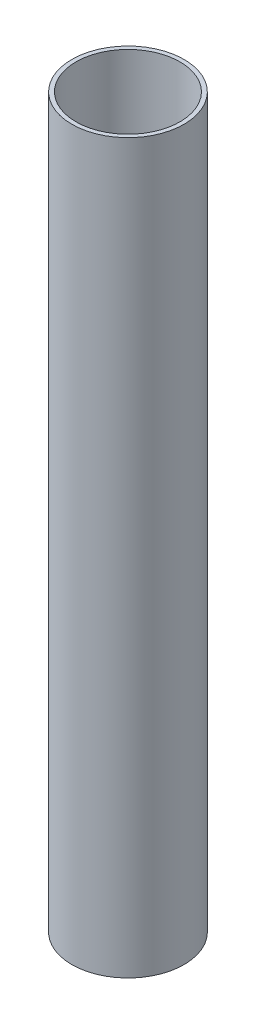
ISO-10303-21;
HEADER;
FILE_DESCRIPTION(('STEP AP214'),'2;1');
FILE_NAME('part.step','',(''),(''),'','','');
FILE_SCHEMA(('AUTOMOTIVE_DESIGN { 1 0 10303 214 1 1 1 1 }'));
ENDSEC;
DATA;
#1=APPLICATION_CONTEXT('core data for automotive mechanical design processes');
#2=APPLICATION_PROTOCOL_DEFINITION('international standard','automotive_design',2000,#1);
#3=PRODUCT_CONTEXT('',#1,'mechanical');
#4=PRODUCT('Part','Part','',(#3));
#5=PRODUCT_RELATED_PRODUCT_CATEGORY('part','',(#4));
#6=PRODUCT_DEFINITION_FORMATION('','',#4);
#7=PRODUCT_DEFINITION_CONTEXT('part definition',#1,'design');
#8=PRODUCT_DEFINITION('design','',#6,#7);
#9=PRODUCT_DEFINITION_SHAPE('','',#8);
#10=(LENGTH_UNIT() NAMED_UNIT(*) SI_UNIT(.MILLI.,.METRE.));
#11=(NAMED_UNIT(*) PLANE_ANGLE_UNIT() SI_UNIT($,.RADIAN.));
#12=(NAMED_UNIT(*) SI_UNIT($,.STERADIAN.) SOLID_ANGLE_UNIT());
#13=UNCERTAINTY_MEASURE_WITH_UNIT(LENGTH_MEASURE(1.E-05),#10,'distance_accuracy_value','');
#14=(GEOMETRIC_REPRESENTATION_CONTEXT(3) GLOBAL_UNCERTAINTY_ASSIGNED_CONTEXT((#13)) GLOBAL_UNIT_ASSIGNED_CONTEXT((#10,
#11,#12)) REPRESENTATION_CONTEXT('',''));
#15=CARTESIAN_POINT('',(0.,0.,0.));
#16=DIRECTION('',(0.,0.,1.));
#17=DIRECTION('',(1.,0.,0.));
#18=AXIS2_PLACEMENT_3D('',#15,#16,#17);
#19=CARTESIAN_POINT('',(0.,177.8,0.));
#20=DIRECTION('',(0.,1.,0.));
#21=DIRECTION('',(0.,0.,1.));
#22=AXIS2_PLACEMENT_3D('',#19,#20,#21);
#23=PLANE('',#22);
#24=CARTESIAN_POINT('',(0.,177.8,0.));
#25=DIRECTION('',(0.,1.,0.));
#26=DIRECTION('',(0.,0.,1.));
#27=AXIS2_PLACEMENT_3D('',#24,#25,#26);
#28=CIRCLE('',#27,13.716);
#29=CARTESIAN_POINT('',(0.,177.8,13.716));
#30=VERTEX_POINT('',#29);
#31=EDGE_CURVE('E10',#30,#30,#28,.T.);
#32=ORIENTED_EDGE('',*,*,#31,.T.);
#33=EDGE_LOOP('',(#32));
#34=FACE_BOUND('',#33,.T.);
#35=CARTESIAN_POINT('',(0.,177.8,0.));
#36=DIRECTION('',(0.,1.,0.));
#37=DIRECTION('',(0.,0.,1.));
#38=AXIS2_PLACEMENT_3D('',#35,#36,#37);
#39=CIRCLE('',#38,12.7);
#40=CARTESIAN_POINT('',(0.,177.8,12.7));
#41=VERTEX_POINT('',#40);
#42=EDGE_CURVE('E41',#41,#41,#39,.T.);
#43=ORIENTED_EDGE('',*,*,#42,.F.);
#44=EDGE_LOOP('',(#43));
#45=FACE_BOUND('',#44,.T.);
#46=ADVANCED_FACE('F30',(#34,#45),#23,.T.);
#47=CARTESIAN_POINT('',(0.,0.,0.));
#48=DIRECTION('',(0.,1.,0.));
#49=DIRECTION('',(0.,0.,1.));
#50=AXIS2_PLACEMENT_3D('',#47,#48,#49);
#51=PLANE('',#50);
#52=CARTESIAN_POINT('',(0.,0.,0.));
#53=DIRECTION('',(0.,1.,0.));
#54=DIRECTION('',(0.,0.,1.));
#55=AXIS2_PLACEMENT_3D('',#52,#53,#54);
#56=CIRCLE('',#55,13.716);
#57=CARTESIAN_POINT('',(0.,0.,13.716));
#58=VERTEX_POINT('',#57);
#59=EDGE_CURVE('E34',#58,#58,#56,.T.);
#60=ORIENTED_EDGE('',*,*,#59,.F.);
#61=EDGE_LOOP('',(#60));
#62=FACE_BOUND('',#61,.T.);
#63=CARTESIAN_POINT('',(0.,0.,0.));
#64=DIRECTION('',(0.,1.,0.));
#65=DIRECTION('',(0.,0.,1.));
#66=AXIS2_PLACEMENT_3D('',#63,#64,#65);
#67=CIRCLE('',#66,12.7);
#68=CARTESIAN_POINT('',(0.,0.,12.7));
#69=VERTEX_POINT('',#68);
#70=EDGE_CURVE('E43',#69,#69,#67,.T.);
#71=ORIENTED_EDGE('',*,*,#70,.T.);
#72=EDGE_LOOP('',(#71));
#73=FACE_BOUND('',#72,.T.);
#74=ADVANCED_FACE('F53',(#62,#73),#51,.F.);
#75=CARTESIAN_POINT('',(0.,177.8,0.));
#76=DIRECTION('',(0.,-1.,0.));
#77=DIRECTION('',(0.,0.,-1.));
#78=AXIS2_PLACEMENT_3D('',#75,#76,#77);
#79=CYLINDRICAL_SURFACE('',#78,13.716);
#80=ORIENTED_EDGE('',*,*,#31,.F.);
#81=EDGE_LOOP('',(#80));
#82=FACE_BOUND('',#81,.T.);
#83=ORIENTED_EDGE('',*,*,#59,.T.);
#84=EDGE_LOOP('',(#83));
#85=FACE_BOUND('',#84,.T.);
#86=ADVANCED_FACE('F32',(#82,#85),#79,.T.);
#87=CARTESIAN_POINT('',(0.,177.8,0.));
#88=DIRECTION('',(0.,-1.,0.));
#89=DIRECTION('',(0.,0.,-1.));
#90=AXIS2_PLACEMENT_3D('',#87,#88,#89);
#91=CYLINDRICAL_SURFACE('',#90,12.7);
#92=ORIENTED_EDGE('',*,*,#42,.T.);
#93=EDGE_LOOP('',(#92));
#94=FACE_BOUND('',#93,.T.);
#95=ORIENTED_EDGE('',*,*,#70,.F.);
#96=EDGE_LOOP('',(#95));
#97=FACE_BOUND('',#96,.T.);
#98=ADVANCED_FACE('F49',(#94,#97),#91,.F.);
#99=CLOSED_SHELL('',(#46,#74,#86,#98));
#100=MANIFOLD_SOLID_BREP('B2',#99);
#101=ADVANCED_BREP_SHAPE_REPRESENTATION('',(#18,#100),#14);
#102=SHAPE_DEFINITION_REPRESENTATION(#9,#101);
ENDSEC;
END-ISO-10303-21;
